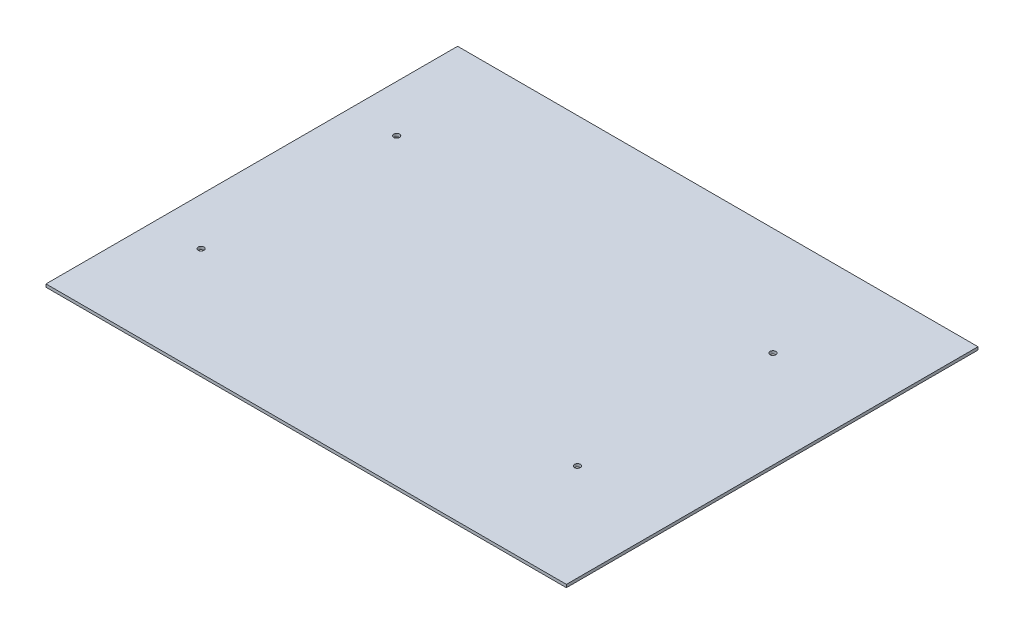
ISO-10303-21;
HEADER;
FILE_DESCRIPTION(('STEP AP214'),'2;1');
FILE_NAME('part.step','',(''),(''),'','','');
FILE_SCHEMA(('AUTOMOTIVE_DESIGN { 1 0 10303 214 1 1 1 1 }'));
ENDSEC;
DATA;
#1=APPLICATION_CONTEXT('core data for automotive mechanical design processes');
#2=APPLICATION_PROTOCOL_DEFINITION('international standard','automotive_design',2000,#1);
#3=PRODUCT_CONTEXT('',#1,'mechanical');
#4=PRODUCT('Part','Part','',(#3));
#5=PRODUCT_RELATED_PRODUCT_CATEGORY('part','',(#4));
#6=PRODUCT_DEFINITION_FORMATION('','',#4);
#7=PRODUCT_DEFINITION_CONTEXT('part definition',#1,'design');
#8=PRODUCT_DEFINITION('design','',#6,#7);
#9=PRODUCT_DEFINITION_SHAPE('','',#8);
#10=(LENGTH_UNIT() NAMED_UNIT(*) SI_UNIT(.MILLI.,.METRE.));
#11=(NAMED_UNIT(*) PLANE_ANGLE_UNIT() SI_UNIT($,.RADIAN.));
#12=(NAMED_UNIT(*) SI_UNIT($,.STERADIAN.) SOLID_ANGLE_UNIT());
#13=UNCERTAINTY_MEASURE_WITH_UNIT(LENGTH_MEASURE(1.E-05),#10,'distance_accuracy_value','');
#14=(GEOMETRIC_REPRESENTATION_CONTEXT(3) GLOBAL_UNCERTAINTY_ASSIGNED_CONTEXT((#13)) GLOBAL_UNIT_ASSIGNED_CONTEXT((#10,
#11,#12)) REPRESENTATION_CONTEXT('',''));
#15=CARTESIAN_POINT('',(0.,0.,0.));
#16=DIRECTION('',(0.,0.,1.));
#17=DIRECTION('',(1.,0.,0.));
#18=AXIS2_PLACEMENT_3D('',#15,#16,#17);
#19=CARTESIAN_POINT('',(865.,5.,-700.));
#20=DIRECTION('',(0.,1.,0.));
#21=DIRECTION('',(0.,0.,1.));
#22=AXIS2_PLACEMENT_3D('',#19,#20,#21);
#23=PLANE('',#22);
#24=DIRECTION('',(0.,0.,-1.));
#25=VECTOR('',#24,1.);
#26=CARTESIAN_POINT('',(885.,5.,0.));
#27=LINE('',#26,#25);
#28=CARTESIAN_POINT('',(885.,5.,0.));
#29=VERTEX_POINT('',#28);
#30=CARTESIAN_POINT('',(885.,5.,-700.));
#31=VERTEX_POINT('',#30);
#32=EDGE_CURVE('E95',#29,#31,#27,.T.);
#33=ORIENTED_EDGE('',*,*,#32,.T.);
#34=DIRECTION('',(-1.,0.,0.));
#35=VECTOR('',#34,1.);
#36=CARTESIAN_POINT('',(0.,5.,-700.));
#37=LINE('',#36,#35);
#38=CARTESIAN_POINT('',(0.,5.,-700.));
#39=VERTEX_POINT('',#38);
#40=EDGE_CURVE('E89',#31,#39,#37,.T.);
#41=ORIENTED_EDGE('',*,*,#40,.T.);
#42=DIRECTION('',(0.,0.,1.));
#43=VECTOR('',#42,1.);
#44=CARTESIAN_POINT('',(0.,5.,0.));
#45=LINE('',#44,#43);
#46=CARTESIAN_POINT('',(0.,5.,0.));
#47=VERTEX_POINT('',#46);
#48=EDGE_CURVE('E85',#39,#47,#45,.T.);
#49=ORIENTED_EDGE('',*,*,#48,.T.);
#50=DIRECTION('',(1.,0.,0.));
#51=VECTOR('',#50,1.);
#52=CARTESIAN_POINT('',(0.,5.,0.));
#53=LINE('',#52,#51);
#54=EDGE_CURVE('E87',#47,#29,#53,.T.);
#55=ORIENTED_EDGE('',*,*,#54,.T.);
#56=EDGE_LOOP('',(#33,#41,#49,#55));
#57=FACE_BOUND('',#56,.T.);
#58=CARTESIAN_POINT('',(720.,5.,-183.75));
#59=DIRECTION('',(0.,1.,0.));
#60=DIRECTION('',(0.,0.,1.));
#61=AXIS2_PLACEMENT_3D('',#58,#59,#60);
#62=CIRCLE('',#61,5.00000000000005);
#63=CARTESIAN_POINT('',(720.,5.,-178.75));
#64=VERTEX_POINT('',#63);
#65=EDGE_CURVE('E49',#64,#64,#62,.T.);
#66=ORIENTED_EDGE('',*,*,#65,.F.);
#67=EDGE_LOOP('',(#66));
#68=FACE_BOUND('',#67,.T.);
#69=CARTESIAN_POINT('',(720.,5.,-516.25));
#70=DIRECTION('',(0.,1.,0.));
#71=DIRECTION('',(0.,0.,1.));
#72=AXIS2_PLACEMENT_3D('',#69,#70,#71);
#73=CIRCLE('',#72,5.00000000000005);
#74=CARTESIAN_POINT('',(720.,5.,-511.25));
#75=VERTEX_POINT('',#74);
#76=EDGE_CURVE('E129',#75,#75,#73,.T.);
#77=ORIENTED_EDGE('',*,*,#76,.F.);
#78=EDGE_LOOP('',(#77));
#79=FACE_BOUND('',#78,.T.);
#80=CARTESIAN_POINT('',(79.9999999999999,5.,-516.25));
#81=DIRECTION('',(0.,1.,0.));
#82=DIRECTION('',(0.,0.,1.));
#83=AXIS2_PLACEMENT_3D('',#80,#81,#82);
#84=CIRCLE('',#83,5.00000000000001);
#85=CARTESIAN_POINT('',(79.9999999999999,5.,-511.25));
#86=VERTEX_POINT('',#85);
#87=EDGE_CURVE('E127',#86,#86,#84,.T.);
#88=ORIENTED_EDGE('',*,*,#87,.F.);
#89=EDGE_LOOP('',(#88));
#90=FACE_BOUND('',#89,.T.);
#91=CARTESIAN_POINT('',(80.,5.,-183.75));
#92=DIRECTION('',(0.,1.,0.));
#93=DIRECTION('',(0.,0.,1.));
#94=AXIS2_PLACEMENT_3D('',#91,#92,#93);
#95=CIRCLE('',#94,5.00000000000001);
#96=CARTESIAN_POINT('',(80.,5.,-178.75));
#97=VERTEX_POINT('',#96);
#98=EDGE_CURVE('E11',#97,#97,#95,.T.);
#99=ORIENTED_EDGE('',*,*,#98,.F.);
#100=EDGE_LOOP('',(#99));
#101=FACE_BOUND('',#100,.T.);
#102=ADVANCED_FACE('F40',(#57,#68,#79,#90,#101),#23,.T.);
#103=CARTESIAN_POINT('',(0.,5.,0.));
#104=DIRECTION('',(0.,0.,-1.));
#105=DIRECTION('',(-1.,0.,0.));
#106=AXIS2_PLACEMENT_3D('',#103,#104,#105);
#107=PLANE('',#106);
#108=ORIENTED_EDGE('',*,*,#54,.F.);
#109=DIRECTION('',(0.,-1.,0.));
#110=VECTOR('',#109,1.);
#111=CARTESIAN_POINT('',(0.,5.,0.));
#112=LINE('',#111,#110);
#113=CARTESIAN_POINT('',(0.,0.,0.));
#114=VERTEX_POINT('',#113);
#115=EDGE_CURVE('E57',#47,#114,#112,.T.);
#116=ORIENTED_EDGE('',*,*,#115,.T.);
#117=DIRECTION('',(1.,0.,0.));
#118=VECTOR('',#117,1.);
#119=CARTESIAN_POINT('',(0.,0.,0.));
#120=LINE('',#119,#118);
#121=CARTESIAN_POINT('',(885.,0.,0.));
#122=VERTEX_POINT('',#121);
#123=EDGE_CURVE('E115',#114,#122,#120,.T.);
#124=ORIENTED_EDGE('',*,*,#123,.T.);
#125=DIRECTION('',(0.,-1.,0.));
#126=VECTOR('',#125,1.);
#127=CARTESIAN_POINT('',(885.,5.,0.));
#128=LINE('',#127,#126);
#129=EDGE_CURVE('E65',#29,#122,#128,.T.);
#130=ORIENTED_EDGE('',*,*,#129,.F.);
#131=EDGE_LOOP('',(#108,#116,#124,#130));
#132=FACE_BOUND('',#131,.T.);
#133=ADVANCED_FACE('F94',(#132),#107,.F.);
#134=CARTESIAN_POINT('',(0.,0.,0.));
#135=DIRECTION('',(0.,-1.,0.));
#136=DIRECTION('',(0.,0.,-1.));
#137=AXIS2_PLACEMENT_3D('',#134,#135,#136);
#138=PLANE('',#137);
#139=CARTESIAN_POINT('',(80.,0.,-183.75));
#140=DIRECTION('',(0.,-1.,0.));
#141=DIRECTION('',(0.,0.,-1.));
#142=AXIS2_PLACEMENT_3D('',#139,#140,#141);
#143=CIRCLE('',#142,5.00000000000001);
#144=CARTESIAN_POINT('',(80.,0.,-188.75));
#145=VERTEX_POINT('',#144);
#146=EDGE_CURVE('E124',#145,#145,#143,.T.);
#147=ORIENTED_EDGE('',*,*,#146,.F.);
#148=EDGE_LOOP('',(#147));
#149=FACE_BOUND('',#148,.T.);
#150=CARTESIAN_POINT('',(720.,0.,-183.75));
#151=DIRECTION('',(0.,-1.,0.));
#152=DIRECTION('',(0.,0.,-1.));
#153=AXIS2_PLACEMENT_3D('',#150,#151,#152);
#154=CIRCLE('',#153,5.00000000000005);
#155=CARTESIAN_POINT('',(720.,0.,-188.75));
#156=VERTEX_POINT('',#155);
#157=EDGE_CURVE('E183',#156,#156,#154,.T.);
#158=ORIENTED_EDGE('',*,*,#157,.F.);
#159=EDGE_LOOP('',(#158));
#160=FACE_BOUND('',#159,.T.);
#161=CARTESIAN_POINT('',(720.,0.,-516.25));
#162=DIRECTION('',(0.,-1.,0.));
#163=DIRECTION('',(0.,0.,-1.));
#164=AXIS2_PLACEMENT_3D('',#161,#162,#163);
#165=CIRCLE('',#164,5.00000000000005);
#166=CARTESIAN_POINT('',(720.,0.,-521.25));
#167=VERTEX_POINT('',#166);
#168=EDGE_CURVE('E181',#167,#167,#165,.T.);
#169=ORIENTED_EDGE('',*,*,#168,.F.);
#170=EDGE_LOOP('',(#169));
#171=FACE_BOUND('',#170,.T.);
#172=CARTESIAN_POINT('',(79.9999999999999,0.,-516.25));
#173=DIRECTION('',(0.,-1.,0.));
#174=DIRECTION('',(0.,0.,-1.));
#175=AXIS2_PLACEMENT_3D('',#172,#173,#174);
#176=CIRCLE('',#175,5.00000000000001);
#177=CARTESIAN_POINT('',(79.9999999999999,0.,-521.25));
#178=VERTEX_POINT('',#177);
#179=EDGE_CURVE('E120',#178,#178,#176,.T.);
#180=ORIENTED_EDGE('',*,*,#179,.F.);
#181=EDGE_LOOP('',(#180));
#182=FACE_BOUND('',#181,.T.);
#183=DIRECTION('',(0.,0.,1.));
#184=VECTOR('',#183,1.);
#185=CARTESIAN_POINT('',(0.,0.,0.));
#186=LINE('',#185,#184);
#187=CARTESIAN_POINT('',(0.,0.,-700.));
#188=VERTEX_POINT('',#187);
#189=EDGE_CURVE('E100',#188,#114,#186,.T.);
#190=ORIENTED_EDGE('',*,*,#189,.F.);
#191=DIRECTION('',(-1.,0.,0.));
#192=VECTOR('',#191,1.);
#193=CARTESIAN_POINT('',(0.,0.,-700.));
#194=LINE('',#193,#192);
#195=CARTESIAN_POINT('',(885.,0.,-700.));
#196=VERTEX_POINT('',#195);
#197=EDGE_CURVE('E92',#196,#188,#194,.T.);
#198=ORIENTED_EDGE('',*,*,#197,.F.);
#199=DIRECTION('',(0.,0.,-1.));
#200=VECTOR('',#199,1.);
#201=CARTESIAN_POINT('',(885.,0.,0.));
#202=LINE('',#201,#200);
#203=EDGE_CURVE('E113',#122,#196,#202,.T.);
#204=ORIENTED_EDGE('',*,*,#203,.F.);
#205=ORIENTED_EDGE('',*,*,#123,.F.);
#206=EDGE_LOOP('',(#190,#198,#204,#205));
#207=FACE_BOUND('',#206,.T.);
#208=ADVANCED_FACE('F117',(#149,#160,#171,#182,#207),#138,.T.);
#209=CARTESIAN_POINT('',(80.,-25.,-183.75));
#210=DIRECTION('',(0.,1.,0.));
#211=DIRECTION('',(0.,0.,1.));
#212=AXIS2_PLACEMENT_3D('',#209,#210,#211);
#213=CYLINDRICAL_SURFACE('',#212,5.00000000000001);
#214=ORIENTED_EDGE('',*,*,#146,.T.);
#215=EDGE_LOOP('',(#214));
#216=FACE_BOUND('',#215,.T.);
#217=ORIENTED_EDGE('',*,*,#98,.T.);
#218=EDGE_LOOP('',(#217));
#219=FACE_BOUND('',#218,.T.);
#220=ADVANCED_FACE('F145',(#216,#219),#213,.F.);
#221=CARTESIAN_POINT('',(720.,-25.,-183.75));
#222=DIRECTION('',(0.,1.,0.));
#223=DIRECTION('',(0.,0.,1.));
#224=AXIS2_PLACEMENT_3D('',#221,#222,#223);
#225=CYLINDRICAL_SURFACE('',#224,5.00000000000005);
#226=ORIENTED_EDGE('',*,*,#157,.T.);
#227=EDGE_LOOP('',(#226));
#228=FACE_BOUND('',#227,.T.);
#229=ORIENTED_EDGE('',*,*,#65,.T.);
#230=EDGE_LOOP('',(#229));
#231=FACE_BOUND('',#230,.T.);
#232=ADVANCED_FACE('F136',(#228,#231),#225,.F.);
#233=CARTESIAN_POINT('',(720.,-25.,-516.25));
#234=DIRECTION('',(0.,1.,0.));
#235=DIRECTION('',(0.,0.,1.));
#236=AXIS2_PLACEMENT_3D('',#233,#234,#235);
#237=CYLINDRICAL_SURFACE('',#236,5.00000000000005);
#238=ORIENTED_EDGE('',*,*,#168,.T.);
#239=EDGE_LOOP('',(#238));
#240=FACE_BOUND('',#239,.T.);
#241=ORIENTED_EDGE('',*,*,#76,.T.);
#242=EDGE_LOOP('',(#241));
#243=FACE_BOUND('',#242,.T.);
#244=ADVANCED_FACE('F153',(#240,#243),#237,.F.);
#245=CARTESIAN_POINT('',(79.9999999999999,-25.,-516.25));
#246=DIRECTION('',(0.,1.,0.));
#247=DIRECTION('',(0.,0.,1.));
#248=AXIS2_PLACEMENT_3D('',#245,#246,#247);
#249=CYLINDRICAL_SURFACE('',#248,5.00000000000001);
#250=ORIENTED_EDGE('',*,*,#179,.T.);
#251=EDGE_LOOP('',(#250));
#252=FACE_BOUND('',#251,.T.);
#253=ORIENTED_EDGE('',*,*,#87,.T.);
#254=EDGE_LOOP('',(#253));
#255=FACE_BOUND('',#254,.T.);
#256=ADVANCED_FACE('F168',(#252,#255),#249,.F.);
#257=CARTESIAN_POINT('',(0.,5.,-700.));
#258=DIRECTION('',(0.,0.,1.));
#259=DIRECTION('',(1.,0.,0.));
#260=AXIS2_PLACEMENT_3D('',#257,#258,#259);
#261=PLANE('',#260);
#262=ORIENTED_EDGE('',*,*,#40,.F.);
#263=DIRECTION('',(0.,-1.,0.));
#264=VECTOR('',#263,1.);
#265=CARTESIAN_POINT('',(885.,5.,-700.));
#266=LINE('',#265,#264);
#267=EDGE_CURVE('E44',#31,#196,#266,.T.);
#268=ORIENTED_EDGE('',*,*,#267,.T.);
#269=ORIENTED_EDGE('',*,*,#197,.T.);
#270=DIRECTION('',(0.,-1.,0.));
#271=VECTOR('',#270,1.);
#272=CARTESIAN_POINT('',(0.,5.,-700.));
#273=LINE('',#272,#271);
#274=EDGE_CURVE('E105',#39,#188,#273,.T.);
#275=ORIENTED_EDGE('',*,*,#274,.F.);
#276=EDGE_LOOP('',(#262,#268,#269,#275));
#277=FACE_BOUND('',#276,.T.);
#278=ADVANCED_FACE('F110',(#277),#261,.F.);
#279=CARTESIAN_POINT('',(0.,5.,0.));
#280=DIRECTION('',(1.,0.,0.));
#281=DIRECTION('',(0.,0.,-1.));
#282=AXIS2_PLACEMENT_3D('',#279,#280,#281);
#283=PLANE('',#282);
#284=ORIENTED_EDGE('',*,*,#48,.F.);
#285=ORIENTED_EDGE('',*,*,#274,.T.);
#286=ORIENTED_EDGE('',*,*,#189,.T.);
#287=ORIENTED_EDGE('',*,*,#115,.F.);
#288=EDGE_LOOP('',(#284,#285,#286,#287));
#289=FACE_BOUND('',#288,.T.);
#290=ADVANCED_FACE('F98',(#289),#283,.F.);
#291=CARTESIAN_POINT('',(885.,5.,0.));
#292=DIRECTION('',(-1.,0.,0.));
#293=DIRECTION('',(0.,0.,1.));
#294=AXIS2_PLACEMENT_3D('',#291,#292,#293);
#295=PLANE('',#294);
#296=ORIENTED_EDGE('',*,*,#32,.F.);
#297=ORIENTED_EDGE('',*,*,#129,.T.);
#298=ORIENTED_EDGE('',*,*,#203,.T.);
#299=ORIENTED_EDGE('',*,*,#267,.F.);
#300=EDGE_LOOP('',(#296,#297,#298,#299));
#301=FACE_BOUND('',#300,.T.);
#302=ADVANCED_FACE('F42',(#301),#295,.F.);
#303=CLOSED_SHELL('',(#102,#133,#208,#220,#232,#244,#256,#278,#290,#302));
#304=MANIFOLD_SOLID_BREP('B2',#303);
#305=ADVANCED_BREP_SHAPE_REPRESENTATION('',(#18,#304),#14);
#306=SHAPE_DEFINITION_REPRESENTATION(#9,#305);
ENDSEC;
END-ISO-10303-21;
